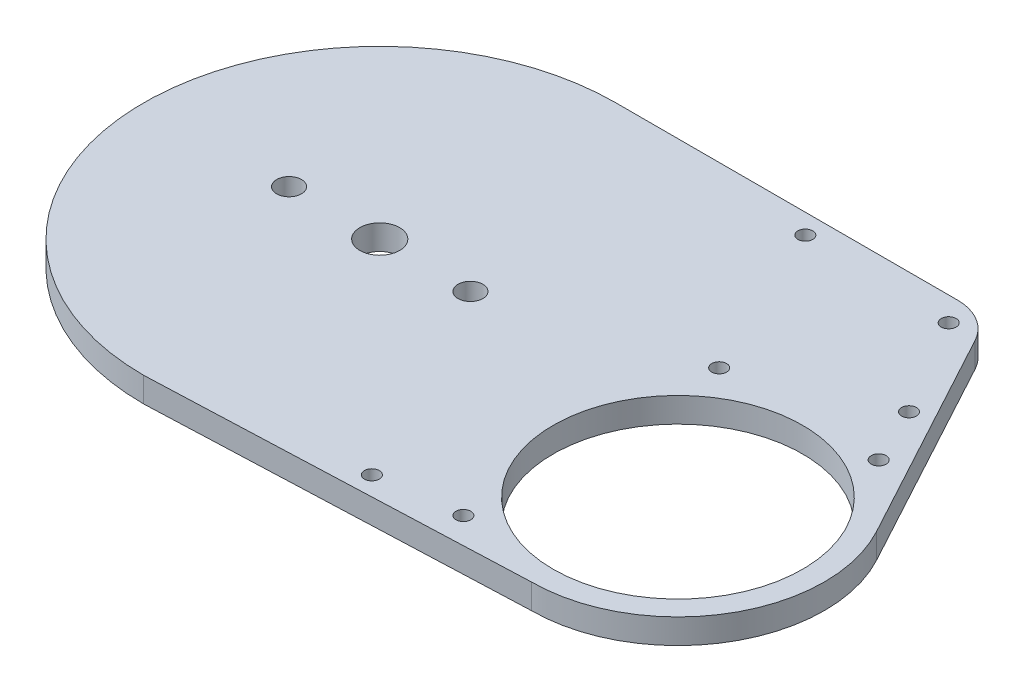
ISO-10303-21;
HEADER;
FILE_DESCRIPTION(('STEP AP214'),'2;1');
FILE_NAME('part.step','',(''),(''),'','','');
FILE_SCHEMA(('AUTOMOTIVE_DESIGN { 1 0 10303 214 1 1 1 1 }'));
ENDSEC;
DATA;
#1=APPLICATION_CONTEXT('core data for automotive mechanical design processes');
#2=APPLICATION_PROTOCOL_DEFINITION('international standard','automotive_design',2000,#1);
#3=PRODUCT_CONTEXT('',#1,'mechanical');
#4=PRODUCT('Part','Part','',(#3));
#5=PRODUCT_RELATED_PRODUCT_CATEGORY('part','',(#4));
#6=PRODUCT_DEFINITION_FORMATION('','',#4);
#7=PRODUCT_DEFINITION_CONTEXT('part definition',#1,'design');
#8=PRODUCT_DEFINITION('design','',#6,#7);
#9=PRODUCT_DEFINITION_SHAPE('','',#8);
#10=(LENGTH_UNIT() NAMED_UNIT(*) SI_UNIT(.MILLI.,.METRE.));
#11=(NAMED_UNIT(*) PLANE_ANGLE_UNIT() SI_UNIT($,.RADIAN.));
#12=(NAMED_UNIT(*) SI_UNIT($,.STERADIAN.) SOLID_ANGLE_UNIT());
#13=UNCERTAINTY_MEASURE_WITH_UNIT(LENGTH_MEASURE(1.E-05),#10,'distance_accuracy_value','');
#14=(GEOMETRIC_REPRESENTATION_CONTEXT(3) GLOBAL_UNCERTAINTY_ASSIGNED_CONTEXT((#13)) GLOBAL_UNIT_ASSIGNED_CONTEXT((#10,
#11,#12)) REPRESENTATION_CONTEXT('',''));
#15=CARTESIAN_POINT('',(0.,0.,0.));
#16=DIRECTION('',(0.,0.,1.));
#17=DIRECTION('',(1.,0.,0.));
#18=AXIS2_PLACEMENT_3D('',#15,#16,#17);
#19=CARTESIAN_POINT('',(0.,5.,0.));
#20=DIRECTION('',(0.,1.,0.));
#21=DIRECTION('',(0.,0.,1.));
#22=AXIS2_PLACEMENT_3D('',#19,#20,#21);
#23=PLANE('',#22);
#24=CARTESIAN_POINT('',(83.3546861288813,5.,-23.142870244782));
#25=DIRECTION('',(0.,1.,0.));
#26=DIRECTION('',(0.,0.,1.));
#27=AXIS2_PLACEMENT_3D('',#24,#25,#26);
#28=CIRCLE('',#27,1.5);
#29=CARTESIAN_POINT('',(83.3546861288813,5.,-21.642870244782));
#30=VERTEX_POINT('',#29);
#31=EDGE_CURVE('E218',#30,#30,#28,.T.);
#32=ORIENTED_EDGE('',*,*,#31,.F.);
#33=EDGE_LOOP('',(#32));
#34=FACE_BOUND('',#33,.T.);
#35=CARTESIAN_POINT('',(71.8354947574246,5.,-42.6542340460468));
#36=DIRECTION('',(0.,1.,0.));
#37=DIRECTION('',(0.,0.,1.));
#38=AXIS2_PLACEMENT_3D('',#35,#36,#37);
#39=CIRCLE('',#38,1.49999999999997);
#40=CARTESIAN_POINT('',(71.8354947574246,5.,-41.1542340460468));
#41=VERTEX_POINT('',#40);
#42=EDGE_CURVE('E230',#41,#41,#39,.T.);
#43=ORIENTED_EDGE('',*,*,#42,.F.);
#44=EDGE_LOOP('',(#43));
#45=FACE_BOUND('',#44,.T.);
#46=CARTESIAN_POINT('',(18.25,5.,0.));
#47=DIRECTION('',(0.,1.,0.));
#48=DIRECTION('',(0.,0.,1.));
#49=AXIS2_PLACEMENT_3D('',#46,#47,#48);
#50=CIRCLE('',#49,2.5);
#51=CARTESIAN_POINT('',(18.25,5.,2.5));
#52=VERTEX_POINT('',#51);
#53=EDGE_CURVE('E242',#52,#52,#50,.T.);
#54=ORIENTED_EDGE('',*,*,#53,.F.);
#55=EDGE_LOOP('',(#54));
#56=FACE_BOUND('',#55,.T.);
#57=CARTESIAN_POINT('',(56.5916963158708,5.,-11.7110072700086));
#58=DIRECTION('',(0.,1.,0.));
#59=DIRECTION('',(0.,0.,1.));
#60=AXIS2_PLACEMENT_3D('',#57,#58,#59);
#61=CIRCLE('',#60,1.5);
#62=CARTESIAN_POINT('',(56.5916963158708,5.,-10.2110072700086));
#63=VERTEX_POINT('',#62);
#64=EDGE_CURVE('E254',#63,#63,#61,.T.);
#65=ORIENTED_EDGE('',*,*,#64,.F.);
#66=EDGE_LOOP('',(#65));
#67=FACE_BOUND('',#66,.T.);
#68=CARTESIAN_POINT('',(0.,5.,0.));
#69=DIRECTION('',(0.,1.,0.));
#70=DIRECTION('',(0.,0.,1.));
#71=AXIS2_PLACEMENT_3D('',#68,#69,#70);
#72=CIRCLE('',#71,4.);
#73=CARTESIAN_POINT('',(0.,5.,4.));
#74=VERTEX_POINT('',#73);
#75=EDGE_CURVE('E266',#74,#74,#72,.T.);
#76=ORIENTED_EDGE('',*,*,#75,.F.);
#77=EDGE_LOOP('',(#76));
#78=FACE_BOUND('',#77,.T.);
#79=CARTESIAN_POINT('',(0.,5.,0.));
#80=DIRECTION('',(0.,1.,0.));
#81=DIRECTION('',(0.,0.,1.));
#82=AXIS2_PLACEMENT_3D('',#79,#80,#81);
#83=CIRCLE('',#82,47.5);
#84=CARTESIAN_POINT('',(0.,5.,-47.5));
#85=VERTEX_POINT('',#84);
#86=CARTESIAN_POINT('',(0.,5.,47.5));
#87=VERTEX_POINT('',#86);
#88=EDGE_CURVE('E130',#85,#87,#83,.T.);
#89=ORIENTED_EDGE('',*,*,#88,.T.);
#90=DIRECTION('',(0.999200958721789,0.,-0.0399680383488717));
#91=VECTOR('',#90,1.);
#92=CARTESIAN_POINT('',(0.,5.,47.5));
#93=LINE('',#92,#91);
#94=CARTESIAN_POINT('',(75.,5.,44.5));
#95=VERTEX_POINT('',#94);
#96=EDGE_CURVE('E88',#87,#95,#93,.T.);
#97=ORIENTED_EDGE('',*,*,#96,.T.);
#98=CARTESIAN_POINT('',(75.,5.,15.));
#99=DIRECTION('',(0.,1.,0.));
#100=DIRECTION('',(0.,0.,1.));
#101=AXIS2_PLACEMENT_3D('',#98,#99,#100);
#102=CIRCLE('',#101,29.5);
#103=CARTESIAN_POINT('',(100.945295539341,5.,0.961067014326345));
#104=VERTEX_POINT('',#103);
#105=EDGE_CURVE('E101',#95,#104,#102,.T.);
#106=ORIENTED_EDGE('',*,*,#105,.T.);
#107=DIRECTION('',(-0.475896033412666,0.,-0.879501543706485));
#108=VECTOR('',#107,1.);
#109=CARTESIAN_POINT('',(77.5590494021998,5.,-42.2589603341267));
#110=LINE('',#109,#108);
#111=CARTESIAN_POINT('',(77.5590494021998,5.,-42.2589603341267));
#112=VERTEX_POINT('',#111);
#113=EDGE_CURVE('E95',#104,#112,#110,.T.);
#114=ORIENTED_EDGE('',*,*,#113,.T.);
#115=CARTESIAN_POINT('',(68.764033965135,5.,-37.5));
#116=DIRECTION('',(0.,1.,0.));
#117=DIRECTION('',(0.,0.,1.));
#118=AXIS2_PLACEMENT_3D('',#115,#116,#117);
#119=CIRCLE('',#118,10.);
#120=CARTESIAN_POINT('',(68.764033965135,5.,-47.5));
#121=VERTEX_POINT('',#120);
#122=EDGE_CURVE('E99',#112,#121,#119,.T.);
#123=ORIENTED_EDGE('',*,*,#122,.T.);
#124=DIRECTION('',(-1.,0.,0.));
#125=VECTOR('',#124,1.);
#126=CARTESIAN_POINT('',(0.,5.,-47.5));
#127=LINE('',#126,#125);
#128=EDGE_CURVE('E51',#121,#85,#127,.T.);
#129=ORIENTED_EDGE('',*,*,#128,.T.);
#130=EDGE_LOOP('',(#89,#97,#106,#114,#123,#129));
#131=FACE_BOUND('',#130,.T.);
#132=CARTESIAN_POINT('',(75.,5.,15.));
#133=DIRECTION('',(0.,1.,0.));
#134=DIRECTION('',(0.,0.,1.));
#135=AXIS2_PLACEMENT_3D('',#132,#133,#134);
#136=CIRCLE('',#135,25.1);
#137=CARTESIAN_POINT('',(75.,5.,40.1));
#138=VERTEX_POINT('',#137);
#139=EDGE_CURVE('E123',#138,#138,#136,.T.);
#140=ORIENTED_EDGE('',*,*,#139,.F.);
#141=EDGE_LOOP('',(#140));
#142=FACE_BOUND('',#141,.T.);
#143=CARTESIAN_POINT('',(88.6880172568585,5.,-11.7110072700086));
#144=DIRECTION('',(0.,1.,0.));
#145=DIRECTION('',(0.,0.,1.));
#146=AXIS2_PLACEMENT_3D('',#143,#144,#145);
#147=CIRCLE('',#146,1.5);
#148=CARTESIAN_POINT('',(88.6880172568585,5.,-10.2110072700086));
#149=VERTEX_POINT('',#148);
#150=EDGE_CURVE('E260',#149,#149,#147,.T.);
#151=ORIENTED_EDGE('',*,*,#150,.F.);
#152=EDGE_LOOP('',(#151));
#153=FACE_BOUND('',#152,.T.);
#154=CARTESIAN_POINT('',(56.5916963158708,5.,39.7686460153643));
#155=DIRECTION('',(0.,1.,0.));
#156=DIRECTION('',(0.,0.,1.));
#157=AXIS2_PLACEMENT_3D('',#154,#155,#156);
#158=CIRCLE('',#157,1.5);
#159=CARTESIAN_POINT('',(56.5916963158708,5.,41.2686460153643));
#160=VERTEX_POINT('',#159);
#161=EDGE_CURVE('E248',#160,#160,#158,.T.);
#162=ORIENTED_EDGE('',*,*,#161,.F.);
#163=EDGE_LOOP('',(#162));
#164=FACE_BOUND('',#163,.T.);
#165=CARTESIAN_POINT('',(-18.25,5.,0.));
#166=DIRECTION('',(0.,1.,0.));
#167=DIRECTION('',(0.,0.,1.));
#168=AXIS2_PLACEMENT_3D('',#165,#166,#167);
#169=CIRCLE('',#168,2.5);
#170=CARTESIAN_POINT('',(-18.25,5.,2.5));
#171=VERTEX_POINT('',#170);
#172=EDGE_CURVE('E236',#171,#171,#169,.T.);
#173=ORIENTED_EDGE('',*,*,#172,.F.);
#174=EDGE_LOOP('',(#173));
#175=FACE_BOUND('',#174,.T.);
#176=CARTESIAN_POINT('',(42.1373349280762,5.,-43.5));
#177=DIRECTION('',(0.,1.,0.));
#178=DIRECTION('',(0.,0.,1.));
#179=AXIS2_PLACEMENT_3D('',#176,#177,#178);
#180=CIRCLE('',#179,1.5);
#181=CARTESIAN_POINT('',(42.1373349280762,5.,-42.));
#182=VERTEX_POINT('',#181);
#183=EDGE_CURVE('E224',#182,#182,#180,.T.);
#184=ORIENTED_EDGE('',*,*,#183,.F.);
#185=EDGE_LOOP('',(#184));
#186=FACE_BOUND('',#185,.T.);
#187=CARTESIAN_POINT('',(40.293422433837,5.,41.8850643816236));
#188=DIRECTION('',(0.,1.,0.));
#189=DIRECTION('',(0.,0.,1.));
#190=AXIS2_PLACEMENT_3D('',#187,#188,#189);
#191=CIRCLE('',#190,1.5);
#192=CARTESIAN_POINT('',(40.293422433837,5.,43.3850643816236));
#193=VERTEX_POINT('',#192);
#194=EDGE_CURVE('E209',#193,#193,#191,.T.);
#195=ORIENTED_EDGE('',*,*,#194,.F.);
#196=EDGE_LOOP('',(#195));
#197=FACE_BOUND('',#196,.T.);
#198=ADVANCED_FACE('F34',(#34,#45,#56,#67,#78,#131,#142,#153,#164,#175,#186,#197),#23,.T.);
#199=CARTESIAN_POINT('',(0.,0.,0.));
#200=DIRECTION('',(0.,1.,0.));
#201=DIRECTION('',(0.,0.,1.));
#202=AXIS2_PLACEMENT_3D('',#199,#200,#201);
#203=PLANE('',#202);
#204=CARTESIAN_POINT('',(0.,0.,0.));
#205=DIRECTION('',(0.,1.,0.));
#206=DIRECTION('',(0.,0.,1.));
#207=AXIS2_PLACEMENT_3D('',#204,#205,#206);
#208=CIRCLE('',#207,47.5);
#209=CARTESIAN_POINT('',(0.,0.,-47.5));
#210=VERTEX_POINT('',#209);
#211=CARTESIAN_POINT('',(0.,0.,47.5));
#212=VERTEX_POINT('',#211);
#213=EDGE_CURVE('E119',#210,#212,#208,.T.);
#214=ORIENTED_EDGE('',*,*,#213,.F.);
#215=DIRECTION('',(-1.,0.,0.));
#216=VECTOR('',#215,1.);
#217=CARTESIAN_POINT('',(0.,0.,-47.5));
#218=LINE('',#217,#216);
#219=CARTESIAN_POINT('',(68.764033965135,0.,-47.5));
#220=VERTEX_POINT('',#219);
#221=EDGE_CURVE('E80',#220,#210,#218,.T.);
#222=ORIENTED_EDGE('',*,*,#221,.F.);
#223=CARTESIAN_POINT('',(68.764033965135,0.,-37.5));
#224=DIRECTION('',(0.,1.,0.));
#225=DIRECTION('',(0.,0.,1.));
#226=AXIS2_PLACEMENT_3D('',#223,#224,#225);
#227=CIRCLE('',#226,10.);
#228=CARTESIAN_POINT('',(77.5590494021998,0.,-42.2589603341267));
#229=VERTEX_POINT('',#228);
#230=EDGE_CURVE('E74',#229,#220,#227,.T.);
#231=ORIENTED_EDGE('',*,*,#230,.F.);
#232=DIRECTION('',(-0.475896033412666,0.,-0.879501543706485));
#233=VECTOR('',#232,1.);
#234=CARTESIAN_POINT('',(77.5590494021998,0.,-42.2589603341267));
#235=LINE('',#234,#233);
#236=CARTESIAN_POINT('',(100.945295539341,0.,0.961067014326345));
#237=VERTEX_POINT('',#236);
#238=EDGE_CURVE('E109',#237,#229,#235,.T.);
#239=ORIENTED_EDGE('',*,*,#238,.F.);
#240=CARTESIAN_POINT('',(75.,0.,15.));
#241=DIRECTION('',(0.,1.,0.));
#242=DIRECTION('',(0.,0.,1.));
#243=AXIS2_PLACEMENT_3D('',#240,#241,#242);
#244=CIRCLE('',#243,29.5);
#245=CARTESIAN_POINT('',(75.,0.,44.5));
#246=VERTEX_POINT('',#245);
#247=EDGE_CURVE('E125',#246,#237,#244,.T.);
#248=ORIENTED_EDGE('',*,*,#247,.F.);
#249=DIRECTION('',(0.999200958721789,0.,-0.0399680383488717));
#250=VECTOR('',#249,1.);
#251=CARTESIAN_POINT('',(0.,0.,47.5));
#252=LINE('',#251,#250);
#253=EDGE_CURVE('E122',#212,#246,#252,.T.);
#254=ORIENTED_EDGE('',*,*,#253,.F.);
#255=EDGE_LOOP('',(#214,#222,#231,#239,#248,#254));
#256=FACE_BOUND('',#255,.T.);
#257=CARTESIAN_POINT('',(75.,0.,15.));
#258=DIRECTION('',(0.,1.,0.));
#259=DIRECTION('',(0.,0.,1.));
#260=AXIS2_PLACEMENT_3D('',#257,#258,#259);
#261=CIRCLE('',#260,25.1);
#262=CARTESIAN_POINT('',(75.,0.,40.1));
#263=VERTEX_POINT('',#262);
#264=EDGE_CURVE('E269',#263,#263,#261,.T.);
#265=ORIENTED_EDGE('',*,*,#264,.T.);
#266=EDGE_LOOP('',(#265));
#267=FACE_BOUND('',#266,.T.);
#268=CARTESIAN_POINT('',(0.,0.,0.));
#269=DIRECTION('',(0.,1.,0.));
#270=DIRECTION('',(0.,0.,1.));
#271=AXIS2_PLACEMENT_3D('',#268,#269,#270);
#272=CIRCLE('',#271,4.);
#273=CARTESIAN_POINT('',(0.,0.,4.));
#274=VERTEX_POINT('',#273);
#275=EDGE_CURVE('E263',#274,#274,#272,.T.);
#276=ORIENTED_EDGE('',*,*,#275,.T.);
#277=EDGE_LOOP('',(#276));
#278=FACE_BOUND('',#277,.T.);
#279=CARTESIAN_POINT('',(88.6880172568585,0.,-11.7110072700086));
#280=DIRECTION('',(0.,1.,0.));
#281=DIRECTION('',(0.,0.,1.));
#282=AXIS2_PLACEMENT_3D('',#279,#280,#281);
#283=CIRCLE('',#282,1.5);
#284=CARTESIAN_POINT('',(88.6880172568585,0.,-10.2110072700086));
#285=VERTEX_POINT('',#284);
#286=EDGE_CURVE('E257',#285,#285,#283,.T.);
#287=ORIENTED_EDGE('',*,*,#286,.T.);
#288=EDGE_LOOP('',(#287));
#289=FACE_BOUND('',#288,.T.);
#290=CARTESIAN_POINT('',(56.5916963158708,0.,-11.7110072700086));
#291=DIRECTION('',(0.,1.,0.));
#292=DIRECTION('',(0.,0.,1.));
#293=AXIS2_PLACEMENT_3D('',#290,#291,#292);
#294=CIRCLE('',#293,1.5);
#295=CARTESIAN_POINT('',(56.5916963158708,0.,-10.2110072700086));
#296=VERTEX_POINT('',#295);
#297=EDGE_CURVE('E251',#296,#296,#294,.T.);
#298=ORIENTED_EDGE('',*,*,#297,.T.);
#299=EDGE_LOOP('',(#298));
#300=FACE_BOUND('',#299,.T.);
#301=CARTESIAN_POINT('',(56.5916963158708,0.,39.7686460153643));
#302=DIRECTION('',(0.,1.,0.));
#303=DIRECTION('',(0.,0.,1.));
#304=AXIS2_PLACEMENT_3D('',#301,#302,#303);
#305=CIRCLE('',#304,1.5);
#306=CARTESIAN_POINT('',(56.5916963158708,0.,41.2686460153643));
#307=VERTEX_POINT('',#306);
#308=EDGE_CURVE('E245',#307,#307,#305,.T.);
#309=ORIENTED_EDGE('',*,*,#308,.T.);
#310=EDGE_LOOP('',(#309));
#311=FACE_BOUND('',#310,.T.);
#312=CARTESIAN_POINT('',(18.25,0.,0.));
#313=DIRECTION('',(0.,1.,0.));
#314=DIRECTION('',(0.,0.,1.));
#315=AXIS2_PLACEMENT_3D('',#312,#313,#314);
#316=CIRCLE('',#315,2.5);
#317=CARTESIAN_POINT('',(18.25,0.,2.5));
#318=VERTEX_POINT('',#317);
#319=EDGE_CURVE('E239',#318,#318,#316,.T.);
#320=ORIENTED_EDGE('',*,*,#319,.T.);
#321=EDGE_LOOP('',(#320));
#322=FACE_BOUND('',#321,.T.);
#323=CARTESIAN_POINT('',(-18.25,0.,0.));
#324=DIRECTION('',(0.,1.,0.));
#325=DIRECTION('',(0.,0.,1.));
#326=AXIS2_PLACEMENT_3D('',#323,#324,#325);
#327=CIRCLE('',#326,2.5);
#328=CARTESIAN_POINT('',(-18.25,0.,2.5));
#329=VERTEX_POINT('',#328);
#330=EDGE_CURVE('E233',#329,#329,#327,.T.);
#331=ORIENTED_EDGE('',*,*,#330,.T.);
#332=EDGE_LOOP('',(#331));
#333=FACE_BOUND('',#332,.T.);
#334=CARTESIAN_POINT('',(71.8354947574246,0.,-42.6542340460468));
#335=DIRECTION('',(0.,1.,0.));
#336=DIRECTION('',(0.,0.,1.));
#337=AXIS2_PLACEMENT_3D('',#334,#335,#336);
#338=CIRCLE('',#337,1.49999999999997);
#339=CARTESIAN_POINT('',(71.8354947574246,0.,-41.1542340460468));
#340=VERTEX_POINT('',#339);
#341=EDGE_CURVE('E227',#340,#340,#338,.T.);
#342=ORIENTED_EDGE('',*,*,#341,.T.);
#343=EDGE_LOOP('',(#342));
#344=FACE_BOUND('',#343,.T.);
#345=CARTESIAN_POINT('',(42.1373349280762,0.,-43.5));
#346=DIRECTION('',(0.,1.,0.));
#347=DIRECTION('',(0.,0.,1.));
#348=AXIS2_PLACEMENT_3D('',#345,#346,#347);
#349=CIRCLE('',#348,1.5);
#350=CARTESIAN_POINT('',(42.1373349280762,0.,-42.));
#351=VERTEX_POINT('',#350);
#352=EDGE_CURVE('E221',#351,#351,#349,.T.);
#353=ORIENTED_EDGE('',*,*,#352,.T.);
#354=EDGE_LOOP('',(#353));
#355=FACE_BOUND('',#354,.T.);
#356=CARTESIAN_POINT('',(83.3546861288813,0.,-23.142870244782));
#357=DIRECTION('',(0.,1.,0.));
#358=DIRECTION('',(0.,0.,1.));
#359=AXIS2_PLACEMENT_3D('',#356,#357,#358);
#360=CIRCLE('',#359,1.5);
#361=CARTESIAN_POINT('',(83.3546861288813,0.,-21.642870244782));
#362=VERTEX_POINT('',#361);
#363=EDGE_CURVE('E215',#362,#362,#360,.T.);
#364=ORIENTED_EDGE('',*,*,#363,.T.);
#365=EDGE_LOOP('',(#364));
#366=FACE_BOUND('',#365,.T.);
#367=CARTESIAN_POINT('',(40.293422433837,0.,41.8850643816236));
#368=DIRECTION('',(0.,1.,0.));
#369=DIRECTION('',(0.,0.,1.));
#370=AXIS2_PLACEMENT_3D('',#367,#368,#369);
#371=CIRCLE('',#370,1.5);
#372=CARTESIAN_POINT('',(40.293422433837,0.,43.3850643816236));
#373=VERTEX_POINT('',#372);
#374=EDGE_CURVE('E212',#373,#373,#371,.T.);
#375=ORIENTED_EDGE('',*,*,#374,.T.);
#376=EDGE_LOOP('',(#375));
#377=FACE_BOUND('',#376,.T.);
#378=ADVANCED_FACE('F139',(#256,#267,#278,#289,#300,#311,#322,#333,#344,#355,#366,#377),#203,.F.);
#379=CARTESIAN_POINT('',(0.,5.,0.));
#380=DIRECTION('',(0.,-1.,0.));
#381=DIRECTION('',(0.,0.,-1.));
#382=AXIS2_PLACEMENT_3D('',#379,#380,#381);
#383=CYLINDRICAL_SURFACE('',#382,47.5);
#384=ORIENTED_EDGE('',*,*,#213,.T.);
#385=DIRECTION('',(0.,-1.,0.));
#386=VECTOR('',#385,1.);
#387=CARTESIAN_POINT('',(0.,5.,47.5));
#388=LINE('',#387,#386);
#389=EDGE_CURVE('E11',#87,#212,#388,.T.);
#390=ORIENTED_EDGE('',*,*,#389,.F.);
#391=ORIENTED_EDGE('',*,*,#88,.F.);
#392=DIRECTION('',(0.,-1.,0.));
#393=VECTOR('',#392,1.);
#394=CARTESIAN_POINT('',(0.,5.,-47.5));
#395=LINE('',#394,#393);
#396=EDGE_CURVE('E115',#85,#210,#395,.T.);
#397=ORIENTED_EDGE('',*,*,#396,.T.);
#398=EDGE_LOOP('',(#384,#390,#391,#397));
#399=FACE_BOUND('',#398,.T.);
#400=ADVANCED_FACE('F36',(#399),#383,.T.);
#401=CARTESIAN_POINT('',(0.,5.,47.5));
#402=DIRECTION('',(-0.0399680383488717,0.,-0.999200958721789));
#403=DIRECTION('',(-0.99920095872179,0.,0.0399680383488717));
#404=AXIS2_PLACEMENT_3D('',#401,#402,#403);
#405=PLANE('',#404);
#406=ORIENTED_EDGE('',*,*,#253,.T.);
#407=DIRECTION('',(0.,-1.,0.));
#408=VECTOR('',#407,1.);
#409=CARTESIAN_POINT('',(75.,5.,44.5));
#410=LINE('',#409,#408);
#411=EDGE_CURVE('E43',#95,#246,#410,.T.);
#412=ORIENTED_EDGE('',*,*,#411,.F.);
#413=ORIENTED_EDGE('',*,*,#96,.F.);
#414=ORIENTED_EDGE('',*,*,#389,.T.);
#415=EDGE_LOOP('',(#406,#412,#413,#414));
#416=FACE_BOUND('',#415,.T.);
#417=ADVANCED_FACE('F390',(#416),#405,.F.);
#418=CARTESIAN_POINT('',(75.,5.,15.));
#419=DIRECTION('',(0.,-1.,0.));
#420=DIRECTION('',(0.,0.,-1.));
#421=AXIS2_PLACEMENT_3D('',#418,#419,#420);
#422=CYLINDRICAL_SURFACE('',#421,29.5);
#423=ORIENTED_EDGE('',*,*,#247,.T.);
#424=DIRECTION('',(0.,-1.,0.));
#425=VECTOR('',#424,1.);
#426=CARTESIAN_POINT('',(100.945295539341,5.,0.961067014326345));
#427=LINE('',#426,#425);
#428=EDGE_CURVE('E110',#104,#237,#427,.T.);
#429=ORIENTED_EDGE('',*,*,#428,.F.);
#430=ORIENTED_EDGE('',*,*,#105,.F.);
#431=ORIENTED_EDGE('',*,*,#411,.T.);
#432=EDGE_LOOP('',(#423,#429,#430,#431));
#433=FACE_BOUND('',#432,.T.);
#434=ADVANCED_FACE('F136',(#433),#422,.T.);
#435=CARTESIAN_POINT('',(77.5590494021998,5.,-42.2589603341267));
#436=DIRECTION('',(-0.879501543706485,0.,0.475896033412666));
#437=DIRECTION('',(0.475896033412666,0.,0.879501543706485));
#438=AXIS2_PLACEMENT_3D('',#435,#436,#437);
#439=PLANE('',#438);
#440=ORIENTED_EDGE('',*,*,#238,.T.);
#441=DIRECTION('',(0.,-1.,0.));
#442=VECTOR('',#441,1.);
#443=CARTESIAN_POINT('',(77.5590494021998,5.,-42.2589603341267));
#444=LINE('',#443,#442);
#445=EDGE_CURVE('E106',#112,#229,#444,.T.);
#446=ORIENTED_EDGE('',*,*,#445,.F.);
#447=ORIENTED_EDGE('',*,*,#113,.F.);
#448=ORIENTED_EDGE('',*,*,#428,.T.);
#449=EDGE_LOOP('',(#440,#446,#447,#448));
#450=FACE_BOUND('',#449,.T.);
#451=ADVANCED_FACE('F107',(#450),#439,.F.);
#452=CARTESIAN_POINT('',(68.764033965135,5.,-37.5));
#453=DIRECTION('',(0.,-1.,0.));
#454=DIRECTION('',(0.,0.,-1.));
#455=AXIS2_PLACEMENT_3D('',#452,#453,#454);
#456=CYLINDRICAL_SURFACE('',#455,10.);
#457=ORIENTED_EDGE('',*,*,#230,.T.);
#458=DIRECTION('',(0.,-1.,0.));
#459=VECTOR('',#458,1.);
#460=CARTESIAN_POINT('',(68.764033965135,5.,-47.5));
#461=LINE('',#460,#459);
#462=EDGE_CURVE('E111',#121,#220,#461,.T.);
#463=ORIENTED_EDGE('',*,*,#462,.F.);
#464=ORIENTED_EDGE('',*,*,#122,.F.);
#465=ORIENTED_EDGE('',*,*,#445,.T.);
#466=EDGE_LOOP('',(#457,#463,#464,#465));
#467=FACE_BOUND('',#466,.T.);
#468=ADVANCED_FACE('F113',(#467),#456,.T.);
#469=CARTESIAN_POINT('',(0.,5.,-47.5));
#470=DIRECTION('',(0.,0.,1.));
#471=DIRECTION('',(1.,0.,0.));
#472=AXIS2_PLACEMENT_3D('',#469,#470,#471);
#473=PLANE('',#472);
#474=ORIENTED_EDGE('',*,*,#221,.T.);
#475=ORIENTED_EDGE('',*,*,#396,.F.);
#476=ORIENTED_EDGE('',*,*,#128,.F.);
#477=ORIENTED_EDGE('',*,*,#462,.T.);
#478=EDGE_LOOP('',(#474,#475,#476,#477));
#479=FACE_BOUND('',#478,.T.);
#480=ADVANCED_FACE('F144',(#479),#473,.F.);
#481=CARTESIAN_POINT('',(75.,5.,15.));
#482=DIRECTION('',(0.,-1.,0.));
#483=DIRECTION('',(0.,0.,-1.));
#484=AXIS2_PLACEMENT_3D('',#481,#482,#483);
#485=CYLINDRICAL_SURFACE('',#484,25.1);
#486=ORIENTED_EDGE('',*,*,#139,.T.);
#487=EDGE_LOOP('',(#486));
#488=FACE_BOUND('',#487,.T.);
#489=ORIENTED_EDGE('',*,*,#264,.F.);
#490=EDGE_LOOP('',(#489));
#491=FACE_BOUND('',#490,.T.);
#492=ADVANCED_FACE('F146',(#488,#491),#485,.F.);
#493=CARTESIAN_POINT('',(0.,5.,0.));
#494=DIRECTION('',(0.,-1.,0.));
#495=DIRECTION('',(0.,0.,-1.));
#496=AXIS2_PLACEMENT_3D('',#493,#494,#495);
#497=CYLINDRICAL_SURFACE('',#496,4.);
#498=ORIENTED_EDGE('',*,*,#75,.T.);
#499=EDGE_LOOP('',(#498));
#500=FACE_BOUND('',#499,.T.);
#501=ORIENTED_EDGE('',*,*,#275,.F.);
#502=EDGE_LOOP('',(#501));
#503=FACE_BOUND('',#502,.T.);
#504=ADVANCED_FACE('F152',(#500,#503),#497,.F.);
#505=CARTESIAN_POINT('',(88.6880172568585,5.,-11.7110072700086));
#506=DIRECTION('',(0.,-1.,0.));
#507=DIRECTION('',(0.,0.,-1.));
#508=AXIS2_PLACEMENT_3D('',#505,#506,#507);
#509=CYLINDRICAL_SURFACE('',#508,1.5);
#510=ORIENTED_EDGE('',*,*,#150,.T.);
#511=EDGE_LOOP('',(#510));
#512=FACE_BOUND('',#511,.T.);
#513=ORIENTED_EDGE('',*,*,#286,.F.);
#514=EDGE_LOOP('',(#513));
#515=FACE_BOUND('',#514,.T.);
#516=ADVANCED_FACE('F168',(#512,#515),#509,.F.);
#517=CARTESIAN_POINT('',(56.5916963158708,5.,-11.7110072700086));
#518=DIRECTION('',(0.,-1.,0.));
#519=DIRECTION('',(0.,0.,-1.));
#520=AXIS2_PLACEMENT_3D('',#517,#518,#519);
#521=CYLINDRICAL_SURFACE('',#520,1.5);
#522=ORIENTED_EDGE('',*,*,#64,.T.);
#523=EDGE_LOOP('',(#522));
#524=FACE_BOUND('',#523,.T.);
#525=ORIENTED_EDGE('',*,*,#297,.F.);
#526=EDGE_LOOP('',(#525));
#527=FACE_BOUND('',#526,.T.);
#528=ADVANCED_FACE('F172',(#524,#527),#521,.F.);
#529=CARTESIAN_POINT('',(56.5916963158708,5.,39.7686460153643));
#530=DIRECTION('',(0.,-1.,0.));
#531=DIRECTION('',(0.,0.,-1.));
#532=AXIS2_PLACEMENT_3D('',#529,#530,#531);
#533=CYLINDRICAL_SURFACE('',#532,1.5);
#534=ORIENTED_EDGE('',*,*,#161,.T.);
#535=EDGE_LOOP('',(#534));
#536=FACE_BOUND('',#535,.T.);
#537=ORIENTED_EDGE('',*,*,#308,.F.);
#538=EDGE_LOOP('',(#537));
#539=FACE_BOUND('',#538,.T.);
#540=ADVANCED_FACE('F176',(#536,#539),#533,.F.);
#541=CARTESIAN_POINT('',(18.25,5.,0.));
#542=DIRECTION('',(0.,-1.,0.));
#543=DIRECTION('',(0.,0.,-1.));
#544=AXIS2_PLACEMENT_3D('',#541,#542,#543);
#545=CYLINDRICAL_SURFACE('',#544,2.5);
#546=ORIENTED_EDGE('',*,*,#53,.T.);
#547=EDGE_LOOP('',(#546));
#548=FACE_BOUND('',#547,.T.);
#549=ORIENTED_EDGE('',*,*,#319,.F.);
#550=EDGE_LOOP('',(#549));
#551=FACE_BOUND('',#550,.T.);
#552=ADVANCED_FACE('F180',(#548,#551),#545,.F.);
#553=CARTESIAN_POINT('',(-18.25,5.,0.));
#554=DIRECTION('',(0.,-1.,0.));
#555=DIRECTION('',(0.,0.,-1.));
#556=AXIS2_PLACEMENT_3D('',#553,#554,#555);
#557=CYLINDRICAL_SURFACE('',#556,2.5);
#558=ORIENTED_EDGE('',*,*,#172,.T.);
#559=EDGE_LOOP('',(#558));
#560=FACE_BOUND('',#559,.T.);
#561=ORIENTED_EDGE('',*,*,#330,.F.);
#562=EDGE_LOOP('',(#561));
#563=FACE_BOUND('',#562,.T.);
#564=ADVANCED_FACE('F184',(#560,#563),#557,.F.);
#565=CARTESIAN_POINT('',(71.8354947574246,5.,-42.6542340460468));
#566=DIRECTION('',(0.,-1.,0.));
#567=DIRECTION('',(0.,0.,-1.));
#568=AXIS2_PLACEMENT_3D('',#565,#566,#567);
#569=CYLINDRICAL_SURFACE('',#568,1.49999999999997);
#570=ORIENTED_EDGE('',*,*,#42,.T.);
#571=EDGE_LOOP('',(#570));
#572=FACE_BOUND('',#571,.T.);
#573=ORIENTED_EDGE('',*,*,#341,.F.);
#574=EDGE_LOOP('',(#573));
#575=FACE_BOUND('',#574,.T.);
#576=ADVANCED_FACE('F188',(#572,#575),#569,.F.);
#577=CARTESIAN_POINT('',(42.1373349280762,5.,-43.5));
#578=DIRECTION('',(0.,-1.,0.));
#579=DIRECTION('',(0.,0.,-1.));
#580=AXIS2_PLACEMENT_3D('',#577,#578,#579);
#581=CYLINDRICAL_SURFACE('',#580,1.5);
#582=ORIENTED_EDGE('',*,*,#183,.T.);
#583=EDGE_LOOP('',(#582));
#584=FACE_BOUND('',#583,.T.);
#585=ORIENTED_EDGE('',*,*,#352,.F.);
#586=EDGE_LOOP('',(#585));
#587=FACE_BOUND('',#586,.T.);
#588=ADVANCED_FACE('F192',(#584,#587),#581,.F.);
#589=CARTESIAN_POINT('',(83.3546861288813,5.,-23.142870244782));
#590=DIRECTION('',(0.,-1.,0.));
#591=DIRECTION('',(0.,0.,-1.));
#592=AXIS2_PLACEMENT_3D('',#589,#590,#591);
#593=CYLINDRICAL_SURFACE('',#592,1.5);
#594=ORIENTED_EDGE('',*,*,#31,.T.);
#595=EDGE_LOOP('',(#594));
#596=FACE_BOUND('',#595,.T.);
#597=ORIENTED_EDGE('',*,*,#363,.F.);
#598=EDGE_LOOP('',(#597));
#599=FACE_BOUND('',#598,.T.);
#600=ADVANCED_FACE('F196',(#596,#599),#593,.F.);
#601=CARTESIAN_POINT('',(40.293422433837,5.,41.8850643816236));
#602=DIRECTION('',(0.,-1.,0.));
#603=DIRECTION('',(0.,0.,-1.));
#604=AXIS2_PLACEMENT_3D('',#601,#602,#603);
#605=CYLINDRICAL_SURFACE('',#604,1.5);
#606=ORIENTED_EDGE('',*,*,#194,.T.);
#607=EDGE_LOOP('',(#606));
#608=FACE_BOUND('',#607,.T.);
#609=ORIENTED_EDGE('',*,*,#374,.F.);
#610=EDGE_LOOP('',(#609));
#611=FACE_BOUND('',#610,.T.);
#612=ADVANCED_FACE('F200',(#608,#611),#605,.F.);
#613=CLOSED_SHELL('',(#198,#378,#400,#417,#434,#451,#468,#480,#492,#504,#516,#528,#540,#552,
#564,#576,#588,#600,#612));
#614=MANIFOLD_SOLID_BREP('B2',#613);
#615=ADVANCED_BREP_SHAPE_REPRESENTATION('',(#18,#614),#14);
#616=SHAPE_DEFINITION_REPRESENTATION(#9,#615);
ENDSEC;
END-ISO-10303-21;
